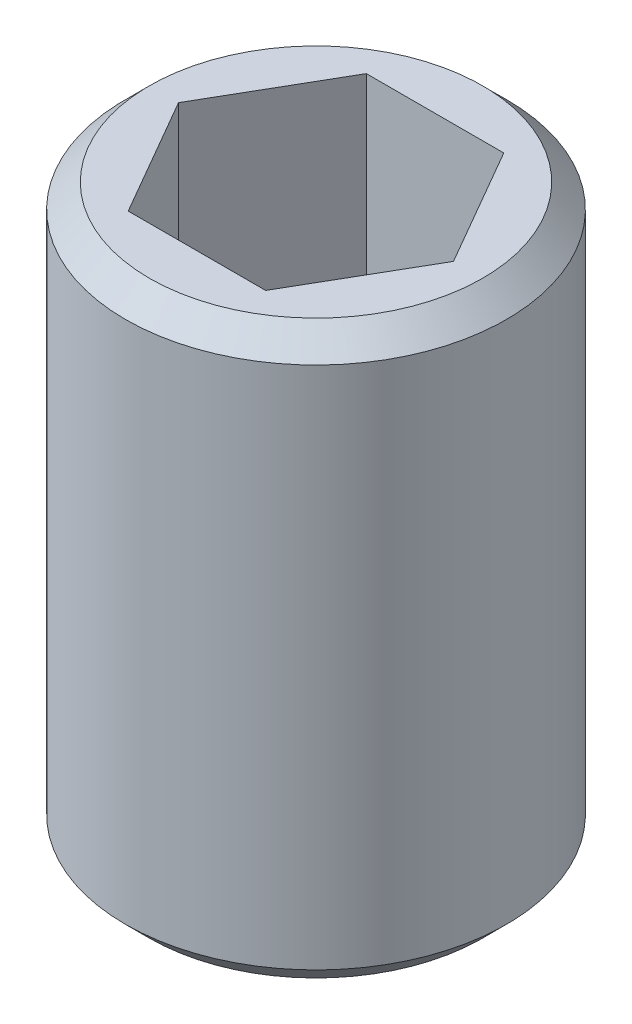
ISO-10303-21;
HEADER;
FILE_DESCRIPTION(('STEP AP214'),'2;1');
FILE_NAME('part.step','',(''),(''),'','','');
FILE_SCHEMA(('AUTOMOTIVE_DESIGN { 1 0 10303 214 1 1 1 1 }'));
ENDSEC;
DATA;
#1=APPLICATION_CONTEXT('core data for automotive mechanical design processes');
#2=APPLICATION_PROTOCOL_DEFINITION('international standard','automotive_design',2000,#1);
#3=PRODUCT_CONTEXT('',#1,'mechanical');
#4=PRODUCT('Part','Part','',(#3));
#5=PRODUCT_RELATED_PRODUCT_CATEGORY('part','',(#4));
#6=PRODUCT_DEFINITION_FORMATION('','',#4);
#7=PRODUCT_DEFINITION_CONTEXT('part definition',#1,'design');
#8=PRODUCT_DEFINITION('design','',#6,#7);
#9=PRODUCT_DEFINITION_SHAPE('','',#8);
#10=(LENGTH_UNIT() NAMED_UNIT(*) SI_UNIT(.MILLI.,.METRE.));
#11=(NAMED_UNIT(*) PLANE_ANGLE_UNIT() SI_UNIT($,.RADIAN.));
#12=(NAMED_UNIT(*) SI_UNIT($,.STERADIAN.) SOLID_ANGLE_UNIT());
#13=UNCERTAINTY_MEASURE_WITH_UNIT(LENGTH_MEASURE(1.E-05),#10,'distance_accuracy_value','');
#14=(GEOMETRIC_REPRESENTATION_CONTEXT(3) GLOBAL_UNCERTAINTY_ASSIGNED_CONTEXT((#13)) GLOBAL_UNIT_ASSIGNED_CONTEXT((#10,
#11,#12)) REPRESENTATION_CONTEXT('',''));
#15=CARTESIAN_POINT('',(0.,0.,0.));
#16=DIRECTION('',(0.,0.,1.));
#17=DIRECTION('',(1.,0.,0.));
#18=AXIS2_PLACEMENT_3D('',#15,#16,#17);
#19=CARTESIAN_POINT('',(0.,-12.,0.));
#20=DIRECTION('',(0.,1.,0.));
#21=DIRECTION('',(0.,0.,1.));
#22=AXIS2_PLACEMENT_3D('',#19,#20,#21);
#23=CYLINDRICAL_SURFACE('',#22,2.1);
#24=CARTESIAN_POINT('',(0.,-12.,0.));
#25=DIRECTION('',(0.,1.,0.));
#26=DIRECTION('',(0.,0.,1.));
#27=AXIS2_PLACEMENT_3D('',#24,#25,#26);
#28=CIRCLE('',#27,2.1);
#29=CARTESIAN_POINT('',(0.,-12.,2.1));
#30=VERTEX_POINT('',#29);
#31=EDGE_CURVE('E161',#30,#30,#28,.T.);
#32=ORIENTED_EDGE('',*,*,#31,.F.);
#33=EDGE_LOOP('',(#32));
#34=FACE_BOUND('',#33,.T.);
#35=CARTESIAN_POINT('',(0.,-4.,0.));
#36=DIRECTION('',(0.,1.,0.));
#37=DIRECTION('',(0.,0.,1.));
#38=AXIS2_PLACEMENT_3D('',#35,#36,#37);
#39=CIRCLE('',#38,2.1);
#40=CARTESIAN_POINT('',(0.,-4.,2.1));
#41=VERTEX_POINT('',#40);
#42=EDGE_CURVE('E155',#41,#41,#39,.F.);
#43=ORIENTED_EDGE('',*,*,#42,.F.);
#44=EDGE_LOOP('',(#43));
#45=FACE_BOUND('',#44,.T.);
#46=ADVANCED_FACE('F51',(#34,#45),#23,.F.);
#47=CARTESIAN_POINT('',(0.,-12.,0.));
#48=DIRECTION('',(0.,1.,0.));
#49=DIRECTION('',(0.,0.,1.));
#50=AXIS2_PLACEMENT_3D('',#47,#48,#49);
#51=CYLINDRICAL_SURFACE('',#50,4.);
#52=CARTESIAN_POINT('',(0.,-0.499999999999999,0.));
#53=DIRECTION('',(0.,1.,0.));
#54=DIRECTION('',(0.,0.,1.));
#55=AXIS2_PLACEMENT_3D('',#52,#53,#54);
#56=CIRCLE('',#55,4.);
#57=CARTESIAN_POINT('',(0.,-0.499999999999999,4.));
#58=VERTEX_POINT('',#57);
#59=EDGE_CURVE('E60',#58,#58,#56,.F.);
#60=ORIENTED_EDGE('',*,*,#59,.T.);
#61=EDGE_LOOP('',(#60));
#62=FACE_BOUND('',#61,.T.);
#63=CARTESIAN_POINT('',(0.,-11.5,0.));
#64=DIRECTION('',(0.,1.,0.));
#65=DIRECTION('',(0.,0.,1.));
#66=AXIS2_PLACEMENT_3D('',#63,#64,#65);
#67=CIRCLE('',#66,4.);
#68=CARTESIAN_POINT('',(0.,-11.5,4.));
#69=VERTEX_POINT('',#68);
#70=EDGE_CURVE('E169',#69,#69,#67,.T.);
#71=ORIENTED_EDGE('',*,*,#70,.T.);
#72=EDGE_LOOP('',(#71));
#73=FACE_BOUND('',#72,.T.);
#74=ADVANCED_FACE('F174',(#62,#73),#51,.T.);
#75=CARTESIAN_POINT('',(0.,-12.,0.));
#76=DIRECTION('',(0.,1.,0.));
#77=DIRECTION('',(0.,0.,1.));
#78=AXIS2_PLACEMENT_3D('',#75,#76,#77);
#79=PLANE('',#78);
#80=CARTESIAN_POINT('',(0.,-12.,0.));
#81=DIRECTION('',(0.,1.,0.));
#82=DIRECTION('',(0.,0.,1.));
#83=AXIS2_PLACEMENT_3D('',#80,#81,#82);
#84=CIRCLE('',#83,3.5);
#85=CARTESIAN_POINT('',(0.,-12.,3.5));
#86=VERTEX_POINT('',#85);
#87=EDGE_CURVE('E11',#86,#86,#84,.F.);
#88=ORIENTED_EDGE('',*,*,#87,.T.);
#89=EDGE_LOOP('',(#88));
#90=FACE_BOUND('',#89,.T.);
#91=ORIENTED_EDGE('',*,*,#31,.T.);
#92=EDGE_LOOP('',(#91));
#93=FACE_BOUND('',#92,.T.);
#94=ADVANCED_FACE('F186',(#90,#93),#79,.F.);
#95=CARTESIAN_POINT('',(0.,0.,0.));
#96=DIRECTION('',(0.,1.,0.));
#97=DIRECTION('',(0.,0.,1.));
#98=AXIS2_PLACEMENT_3D('',#95,#96,#97);
#99=PLANE('',#98);
#100=CARTESIAN_POINT('',(0.,0.,0.));
#101=DIRECTION('',(0.,1.,0.));
#102=DIRECTION('',(0.,0.,1.));
#103=AXIS2_PLACEMENT_3D('',#100,#101,#102);
#104=CIRCLE('',#103,3.5);
#105=CARTESIAN_POINT('',(0.,0.,3.5));
#106=VERTEX_POINT('',#105);
#107=EDGE_CURVE('E164',#106,#106,#104,.T.);
#108=ORIENTED_EDGE('',*,*,#107,.T.);
#109=EDGE_LOOP('',(#108));
#110=FACE_BOUND('',#109,.T.);
#111=DIRECTION('',(0.5,0.,-0.866025403784439));
#112=VECTOR('',#111,1.);
#113=CARTESIAN_POINT('',(1.44337567297406,0.,2.5));
#114=LINE('',#113,#112);
#115=CARTESIAN_POINT('',(1.44337567297406,0.,2.5));
#116=VERTEX_POINT('',#115);
#117=CARTESIAN_POINT('',(2.88675134594813,0.,0.));
#118=VERTEX_POINT('',#117);
#119=EDGE_CURVE('E67',#116,#118,#114,.T.);
#120=ORIENTED_EDGE('',*,*,#119,.F.);
#121=DIRECTION('',(1.,0.,0.));
#122=VECTOR('',#121,1.);
#123=CARTESIAN_POINT('',(-1.44337567297406,0.,2.5));
#124=LINE('',#123,#122);
#125=CARTESIAN_POINT('',(-1.44337567297406,0.,2.5));
#126=VERTEX_POINT('',#125);
#127=EDGE_CURVE('E151',#126,#116,#124,.T.);
#128=ORIENTED_EDGE('',*,*,#127,.F.);
#129=DIRECTION('',(0.5,0.,0.866025403784438));
#130=VECTOR('',#129,1.);
#131=CARTESIAN_POINT('',(-2.88675134594813,0.,0.));
#132=LINE('',#131,#130);
#133=CARTESIAN_POINT('',(-2.88675134594813,0.,0.));
#134=VERTEX_POINT('',#133);
#135=EDGE_CURVE('E149',#134,#126,#132,.T.);
#136=ORIENTED_EDGE('',*,*,#135,.F.);
#137=DIRECTION('',(-0.5,0.,0.866025403784439));
#138=VECTOR('',#137,1.);
#139=CARTESIAN_POINT('',(-1.44337567297407,0.,-2.5));
#140=LINE('',#139,#138);
#141=CARTESIAN_POINT('',(-1.44337567297407,0.,-2.5));
#142=VERTEX_POINT('',#141);
#143=EDGE_CURVE('E115',#142,#134,#140,.T.);
#144=ORIENTED_EDGE('',*,*,#143,.F.);
#145=DIRECTION('',(-1.,0.,0.));
#146=VECTOR('',#145,1.);
#147=CARTESIAN_POINT('',(1.44337567297406,0.,-2.5));
#148=LINE('',#147,#146);
#149=CARTESIAN_POINT('',(1.44337567297406,0.,-2.5));
#150=VERTEX_POINT('',#149);
#151=EDGE_CURVE('E145',#150,#142,#148,.T.);
#152=ORIENTED_EDGE('',*,*,#151,.F.);
#153=DIRECTION('',(-0.5,0.,-0.866025403784438));
#154=VECTOR('',#153,1.);
#155=CARTESIAN_POINT('',(2.88675134594813,0.,0.));
#156=LINE('',#155,#154);
#157=EDGE_CURVE('E142',#118,#150,#156,.T.);
#158=ORIENTED_EDGE('',*,*,#157,.F.);
#159=EDGE_LOOP('',(#120,#128,#136,#144,#152,#158));
#160=FACE_BOUND('',#159,.T.);
#161=ADVANCED_FACE('F183',(#110,#160),#99,.T.);
#162=CARTESIAN_POINT('',(0.,-4.,0.));
#163=DIRECTION('',(0.,1.,0.));
#164=DIRECTION('',(0.,0.,1.));
#165=AXIS2_PLACEMENT_3D('',#162,#163,#164);
#166=PLANE('',#165);
#167=DIRECTION('',(0.5,0.,-0.866025403784439));
#168=VECTOR('',#167,1.);
#169=CARTESIAN_POINT('',(1.44337567297406,-4.,2.5));
#170=LINE('',#169,#168);
#171=CARTESIAN_POINT('',(1.44337567297406,-4.,2.5));
#172=VERTEX_POINT('',#171);
#173=CARTESIAN_POINT('',(2.88675134594813,-4.,0.));
#174=VERTEX_POINT('',#173);
#175=EDGE_CURVE('E153',#172,#174,#170,.T.);
#176=ORIENTED_EDGE('',*,*,#175,.T.);
#177=DIRECTION('',(-0.5,0.,-0.866025403784438));
#178=VECTOR('',#177,1.);
#179=CARTESIAN_POINT('',(2.88675134594813,-4.,0.));
#180=LINE('',#179,#178);
#181=CARTESIAN_POINT('',(1.44337567297406,-4.,-2.5));
#182=VERTEX_POINT('',#181);
#183=EDGE_CURVE('E136',#174,#182,#180,.T.);
#184=ORIENTED_EDGE('',*,*,#183,.T.);
#185=DIRECTION('',(-1.,0.,0.));
#186=VECTOR('',#185,1.);
#187=CARTESIAN_POINT('',(1.44337567297406,-4.,-2.5));
#188=LINE('',#187,#186);
#189=CARTESIAN_POINT('',(-1.44337567297407,-4.,-2.5));
#190=VERTEX_POINT('',#189);
#191=EDGE_CURVE('E134',#182,#190,#188,.T.);
#192=ORIENTED_EDGE('',*,*,#191,.T.);
#193=DIRECTION('',(-0.5,0.,0.866025403784439));
#194=VECTOR('',#193,1.);
#195=CARTESIAN_POINT('',(-1.44337567297407,-4.,-2.5));
#196=LINE('',#195,#194);
#197=CARTESIAN_POINT('',(-2.88675134594813,-4.,0.));
#198=VERTEX_POINT('',#197);
#199=EDGE_CURVE('E112',#190,#198,#196,.T.);
#200=ORIENTED_EDGE('',*,*,#199,.T.);
#201=DIRECTION('',(0.5,0.,0.866025403784438));
#202=VECTOR('',#201,1.);
#203=CARTESIAN_POINT('',(-2.88675134594813,-4.,0.));
#204=LINE('',#203,#202);
#205=CARTESIAN_POINT('',(-1.44337567297406,-4.,2.5));
#206=VERTEX_POINT('',#205);
#207=EDGE_CURVE('E123',#198,#206,#204,.T.);
#208=ORIENTED_EDGE('',*,*,#207,.T.);
#209=DIRECTION('',(1.,0.,0.));
#210=VECTOR('',#209,1.);
#211=CARTESIAN_POINT('',(-1.44337567297406,-4.,2.5));
#212=LINE('',#211,#210);
#213=EDGE_CURVE('E127',#206,#172,#212,.T.);
#214=ORIENTED_EDGE('',*,*,#213,.T.);
#215=EDGE_LOOP('',(#176,#184,#192,#200,#208,#214));
#216=FACE_BOUND('',#215,.T.);
#217=ORIENTED_EDGE('',*,*,#42,.T.);
#218=EDGE_LOOP('',(#217));
#219=FACE_BOUND('',#218,.T.);
#220=ADVANCED_FACE('F130',(#216,#219),#166,.T.);
#221=CARTESIAN_POINT('',(1.44337567297406,-4.,2.5));
#222=DIRECTION('',(0.866025403784439,0.,0.5));
#223=DIRECTION('',(0.5,0.,-0.866025403784439));
#224=AXIS2_PLACEMENT_3D('',#221,#222,#223);
#225=PLANE('',#224);
#226=ORIENTED_EDGE('',*,*,#119,.T.);
#227=DIRECTION('',(0.,1.,0.));
#228=VECTOR('',#227,1.);
#229=CARTESIAN_POINT('',(2.88675134594813,-4.,0.));
#230=LINE('',#229,#228);
#231=EDGE_CURVE('E97',#174,#118,#230,.T.);
#232=ORIENTED_EDGE('',*,*,#231,.F.);
#233=ORIENTED_EDGE('',*,*,#175,.F.);
#234=DIRECTION('',(0.,1.,0.));
#235=VECTOR('',#234,1.);
#236=CARTESIAN_POINT('',(1.44337567297406,-4.,2.5));
#237=LINE('',#236,#235);
#238=EDGE_CURVE('E75',#172,#116,#237,.T.);
#239=ORIENTED_EDGE('',*,*,#238,.T.);
#240=EDGE_LOOP('',(#226,#232,#233,#239));
#241=FACE_BOUND('',#240,.T.);
#242=ADVANCED_FACE('F193',(#241),#225,.F.);
#243=CARTESIAN_POINT('',(-1.44337567297406,-4.,2.5));
#244=DIRECTION('',(0.,0.,1.));
#245=DIRECTION('',(1.,0.,0.));
#246=AXIS2_PLACEMENT_3D('',#243,#244,#245);
#247=PLANE('',#246);
#248=ORIENTED_EDGE('',*,*,#127,.T.);
#249=ORIENTED_EDGE('',*,*,#238,.F.);
#250=ORIENTED_EDGE('',*,*,#213,.F.);
#251=DIRECTION('',(0.,1.,0.));
#252=VECTOR('',#251,1.);
#253=CARTESIAN_POINT('',(-1.44337567297406,-4.,2.5));
#254=LINE('',#253,#252);
#255=EDGE_CURVE('E119',#206,#126,#254,.T.);
#256=ORIENTED_EDGE('',*,*,#255,.T.);
#257=EDGE_LOOP('',(#248,#249,#250,#256));
#258=FACE_BOUND('',#257,.T.);
#259=ADVANCED_FACE('F195',(#258),#247,.F.);
#260=CARTESIAN_POINT('',(-2.88675134594813,-4.,0.));
#261=DIRECTION('',(-0.866025403784438,0.,0.5));
#262=DIRECTION('',(0.5,0.,0.866025403784438));
#263=AXIS2_PLACEMENT_3D('',#260,#261,#262);
#264=PLANE('',#263);
#265=ORIENTED_EDGE('',*,*,#135,.T.);
#266=ORIENTED_EDGE('',*,*,#255,.F.);
#267=ORIENTED_EDGE('',*,*,#207,.F.);
#268=DIRECTION('',(0.,1.,0.));
#269=VECTOR('',#268,1.);
#270=CARTESIAN_POINT('',(-2.88675134594813,-4.,0.));
#271=LINE('',#270,#269);
#272=EDGE_CURVE('E108',#198,#134,#271,.T.);
#273=ORIENTED_EDGE('',*,*,#272,.T.);
#274=EDGE_LOOP('',(#265,#266,#267,#273));
#275=FACE_BOUND('',#274,.T.);
#276=ADVANCED_FACE('F124',(#275),#264,.F.);
#277=CARTESIAN_POINT('',(-1.44337567297407,-4.,-2.5));
#278=DIRECTION('',(-0.866025403784439,0.,-0.5));
#279=DIRECTION('',(-0.5,0.,0.866025403784439));
#280=AXIS2_PLACEMENT_3D('',#277,#278,#279);
#281=PLANE('',#280);
#282=ORIENTED_EDGE('',*,*,#143,.T.);
#283=ORIENTED_EDGE('',*,*,#272,.F.);
#284=ORIENTED_EDGE('',*,*,#199,.F.);
#285=DIRECTION('',(0.,1.,0.));
#286=VECTOR('',#285,1.);
#287=CARTESIAN_POINT('',(-1.44337567297407,-4.,-2.5));
#288=LINE('',#287,#286);
#289=EDGE_CURVE('E120',#190,#142,#288,.T.);
#290=ORIENTED_EDGE('',*,*,#289,.T.);
#291=EDGE_LOOP('',(#282,#283,#284,#290));
#292=FACE_BOUND('',#291,.T.);
#293=ADVANCED_FACE('F110',(#292),#281,.F.);
#294=CARTESIAN_POINT('',(1.44337567297406,-4.,-2.5));
#295=DIRECTION('',(0.,0.,-1.));
#296=DIRECTION('',(-1.,0.,0.));
#297=AXIS2_PLACEMENT_3D('',#294,#295,#296);
#298=PLANE('',#297);
#299=ORIENTED_EDGE('',*,*,#151,.T.);
#300=ORIENTED_EDGE('',*,*,#289,.F.);
#301=ORIENTED_EDGE('',*,*,#191,.F.);
#302=DIRECTION('',(0.,1.,0.));
#303=VECTOR('',#302,1.);
#304=CARTESIAN_POINT('',(1.44337567297406,-4.,-2.5));
#305=LINE('',#304,#303);
#306=EDGE_CURVE('E158',#182,#150,#305,.T.);
#307=ORIENTED_EDGE('',*,*,#306,.T.);
#308=EDGE_LOOP('',(#299,#300,#301,#307));
#309=FACE_BOUND('',#308,.T.);
#310=ADVANCED_FACE('F290',(#309),#298,.F.);
#311=CARTESIAN_POINT('',(2.88675134594813,-4.,0.));
#312=DIRECTION('',(0.866025403784438,0.,-0.5));
#313=DIRECTION('',(-0.5,0.,-0.866025403784438));
#314=AXIS2_PLACEMENT_3D('',#311,#312,#313);
#315=PLANE('',#314);
#316=ORIENTED_EDGE('',*,*,#157,.T.);
#317=ORIENTED_EDGE('',*,*,#306,.F.);
#318=ORIENTED_EDGE('',*,*,#183,.F.);
#319=ORIENTED_EDGE('',*,*,#231,.T.);
#320=EDGE_LOOP('',(#316,#317,#318,#319));
#321=FACE_BOUND('',#320,.T.);
#322=ADVANCED_FACE('F180',(#321),#315,.F.);
#323=CARTESIAN_POINT('',(0.,0.,0.));
#324=DIRECTION('',(0.,-1.,0.));
#325=DIRECTION('',(0.,0.,-1.));
#326=AXIS2_PLACEMENT_3D('',#323,#324,#325);
#327=CONICAL_SURFACE('',#326,3.5,0.785398163397448);
#328=ORIENTED_EDGE('',*,*,#59,.F.);
#329=EDGE_LOOP('',(#328));
#330=FACE_BOUND('',#329,.T.);
#331=ORIENTED_EDGE('',*,*,#107,.F.);
#332=EDGE_LOOP('',(#331));
#333=FACE_BOUND('',#332,.T.);
#334=ADVANCED_FACE('F177',(#330,#333),#327,.T.);
#335=CARTESIAN_POINT('',(0.,-11.5,0.));
#336=DIRECTION('',(0.,1.,0.));
#337=DIRECTION('',(0.,0.,1.));
#338=AXIS2_PLACEMENT_3D('',#335,#336,#337);
#339=CONICAL_SURFACE('',#338,4.,0.78539816339745);
#340=ORIENTED_EDGE('',*,*,#87,.F.);
#341=EDGE_LOOP('',(#340));
#342=FACE_BOUND('',#341,.T.);
#343=ORIENTED_EDGE('',*,*,#70,.F.);
#344=EDGE_LOOP('',(#343));
#345=FACE_BOUND('',#344,.T.);
#346=ADVANCED_FACE('F54',(#342,#345),#339,.T.);
#347=CLOSED_SHELL('',(#46,#74,#94,#161,#220,#242,#259,#276,#293,#310,#322,#334,#346));
#348=MANIFOLD_SOLID_BREP('B2',#347);
#349=ADVANCED_BREP_SHAPE_REPRESENTATION('',(#18,#348),#14);
#350=SHAPE_DEFINITION_REPRESENTATION(#9,#349);
ENDSEC;
END-ISO-10303-21;
